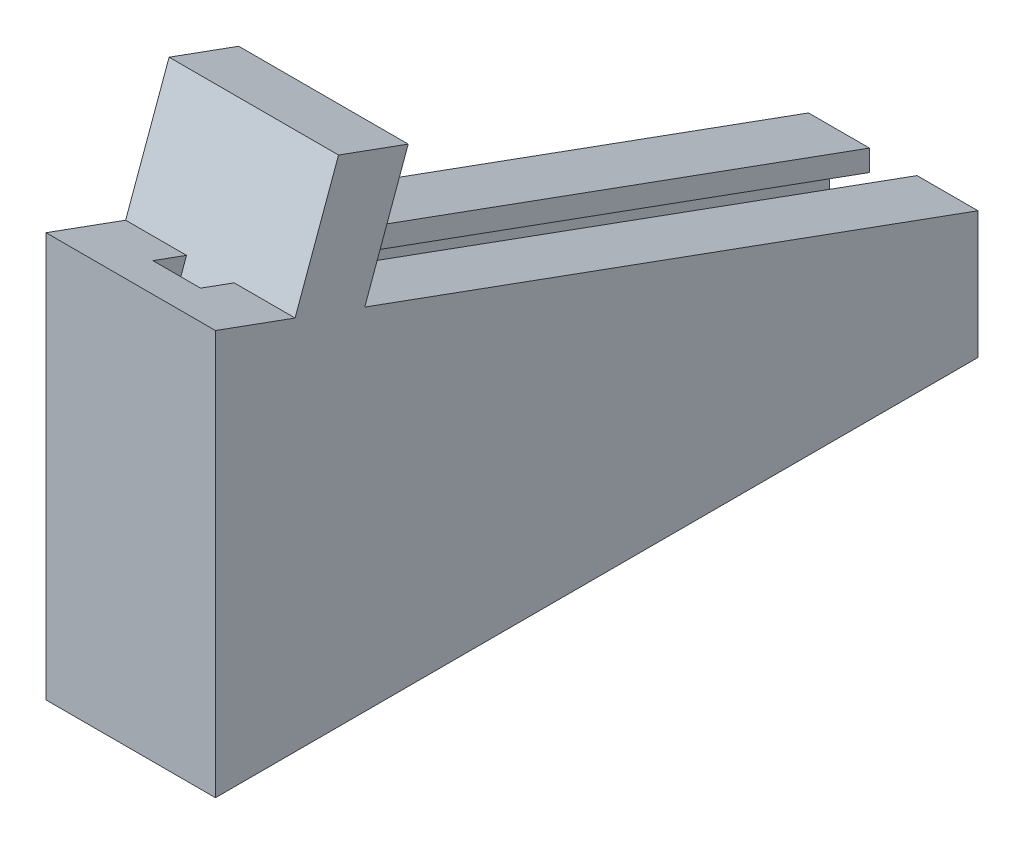
ISO-10303-21;
HEADER;
FILE_DESCRIPTION(('STEP AP214'),'2;1');
FILE_NAME('part.step','',(''),(''),'','','');
FILE_SCHEMA(('AUTOMOTIVE_DESIGN { 1 0 10303 214 1 1 1 1 }'));
ENDSEC;
DATA;
#1=APPLICATION_CONTEXT('core data for automotive mechanical design processes');
#2=APPLICATION_PROTOCOL_DEFINITION('international standard','automotive_design',2000,#1);
#3=PRODUCT_CONTEXT('',#1,'mechanical');
#4=PRODUCT('Part','Part','',(#3));
#5=PRODUCT_RELATED_PRODUCT_CATEGORY('part','',(#4));
#6=PRODUCT_DEFINITION_FORMATION('','',#4);
#7=PRODUCT_DEFINITION_CONTEXT('part definition',#1,'design');
#8=PRODUCT_DEFINITION('design','',#6,#7);
#9=PRODUCT_DEFINITION_SHAPE('','',#8);
#10=(LENGTH_UNIT() NAMED_UNIT(*) SI_UNIT(.MILLI.,.METRE.));
#11=(NAMED_UNIT(*) PLANE_ANGLE_UNIT() SI_UNIT($,.RADIAN.));
#12=(NAMED_UNIT(*) SI_UNIT($,.STERADIAN.) SOLID_ANGLE_UNIT());
#13=UNCERTAINTY_MEASURE_WITH_UNIT(LENGTH_MEASURE(1.E-05),#10,'distance_accuracy_value','');
#14=(GEOMETRIC_REPRESENTATION_CONTEXT(3) GLOBAL_UNCERTAINTY_ASSIGNED_CONTEXT((#13)) GLOBAL_UNIT_ASSIGNED_CONTEXT((#10,
#11,#12)) REPRESENTATION_CONTEXT('',''));
#15=CARTESIAN_POINT('',(0.,0.,0.));
#16=DIRECTION('',(0.,0.,1.));
#17=DIRECTION('',(1.,0.,0.));
#18=AXIS2_PLACEMENT_3D('',#15,#16,#17);
#19=CARTESIAN_POINT('',(-8.,4.71740096382082,-1.71699353392944));
#20=DIRECTION('',(0.,0.939692620785911,-0.342020143325663));
#21=DIRECTION('',(0.,0.342020143325663,0.939692620785911));
#22=AXIS2_PLACEMENT_3D('',#19,#20,#21);
#23=PLANE('',#22);
#24=DIRECTION('',(-1.,0.,0.));
#25=VECTOR('',#24,1.);
#26=CARTESIAN_POINT('',(-8.,6.75483142002953,3.88080063821321));
#27=LINE('',#26,#25);
#28=CARTESIAN_POINT('',(-5.125,6.75483142002951,3.88080063821321));
#29=VERTEX_POINT('',#28);
#30=CARTESIAN_POINT('',(-8.,6.75483142002953,3.8808006382132));
#31=VERTEX_POINT('',#30);
#32=EDGE_CURVE('E268',#29,#31,#27,.T.);
#33=ORIENTED_EDGE('',*,*,#32,.F.);
#34=DIRECTION('',(0.,0.342020143325662,0.939692620785911));
#35=VECTOR('',#34,1.);
#36=CARTESIAN_POINT('',(-5.125,-4.1473898973855,-26.072806253282));
#37=LINE('',#36,#35);
#38=CARTESIAN_POINT('',(-5.125,-3.78294593861105,-25.0715047058925));
#39=VERTEX_POINT('',#38);
#40=EDGE_CURVE('E310',#39,#29,#37,.T.);
#41=ORIENTED_EDGE('',*,*,#40,.F.);
#42=DIRECTION('',(1.,0.,0.));
#43=VECTOR('',#42,1.);
#44=CARTESIAN_POINT('',(-8.,-3.78294593861103,-25.0715047058925));
#45=LINE('',#44,#43);
#46=CARTESIAN_POINT('',(-8.,-3.78294593861103,-25.0715047058925));
#47=VERTEX_POINT('',#46);
#48=EDGE_CURVE('E370',#47,#39,#45,.T.);
#49=ORIENTED_EDGE('',*,*,#48,.F.);
#50=DIRECTION('',(0.,0.342020143325663,0.939692620785911));
#51=VECTOR('',#50,1.);
#52=CARTESIAN_POINT('',(-8.,4.71740096382082,-1.71699353392944));
#53=LINE('',#52,#51);
#54=EDGE_CURVE('E58',#47,#31,#53,.T.);
#55=ORIENTED_EDGE('',*,*,#54,.T.);
#56=EDGE_LOOP('',(#33,#41,#49,#55));
#57=FACE_BOUND('',#56,.T.);
#58=ADVANCED_FACE('F35',(#57),#23,.T.);
#59=CARTESIAN_POINT('',(0.,6.75483142002953,3.8808006382132));
#60=VERTEX_POINT('',#59);
#61=CARTESIAN_POINT('',(-2.875,6.75483142002951,3.88080063821321));
#62=VERTEX_POINT('',#61);
#63=EDGE_CURVE('E270',#60,#62,#27,.T.);
#64=ORIENTED_EDGE('',*,*,#63,.F.);
#65=DIRECTION('',(0.,0.342020143325663,0.939692620785911));
#66=VECTOR('',#65,1.);
#67=CARTESIAN_POINT('',(0.,4.71740096382082,-1.71699353392944));
#68=LINE('',#67,#66);
#69=CARTESIAN_POINT('',(0.,-3.78294593861103,-25.0715047058925));
#70=VERTEX_POINT('',#69);
#71=EDGE_CURVE('E359',#70,#60,#68,.T.);
#72=ORIENTED_EDGE('',*,*,#71,.F.);
#73=CARTESIAN_POINT('',(-2.875,-3.78294593861105,-25.0715047058925));
#74=VERTEX_POINT('',#73);
#75=EDGE_CURVE('E373',#74,#70,#45,.T.);
#76=ORIENTED_EDGE('',*,*,#75,.F.);
#77=DIRECTION('',(0.,0.342020143325662,0.939692620785911));
#78=VECTOR('',#77,1.);
#79=CARTESIAN_POINT('',(-2.875,-4.1473898973855,-26.072806253282));
#80=LINE('',#79,#78);
#81=EDGE_CURVE('E305',#74,#62,#80,.T.);
#82=ORIENTED_EDGE('',*,*,#81,.T.);
#83=EDGE_LOOP('',(#64,#72,#76,#82));
#84=FACE_BOUND('',#83,.T.);
#85=ADVANCED_FACE('F390',(#84),#23,.T.);
#86=CARTESIAN_POINT('',(-2.875,-4.1473898973855,-26.072806253282));
#87=DIRECTION('',(-1.,0.,0.));
#88=DIRECTION('',(0.,0.,1.));
#89=AXIS2_PLACEMENT_3D('',#86,#87,#88);
#90=PLANE('',#89);
#91=DIRECTION('',(0.,-0.939692620785911,0.342020143325663));
#92=VECTOR('',#91,1.);
#93=CARTESIAN_POINT('',(-2.875,6.75483142002952,3.88080063821321));
#94=LINE('',#93,#92);
#95=CARTESIAN_POINT('',(-2.875,5.87180919847001,4.20219444305649));
#96=VERTEX_POINT('',#95);
#97=EDGE_CURVE('E265',#62,#96,#94,.T.);
#98=ORIENTED_EDGE('',*,*,#97,.F.);
#99=ORIENTED_EDGE('',*,*,#81,.F.);
#100=DIRECTION('',(0.,-1.,0.));
#101=VECTOR('',#100,1.);
#102=CARTESIAN_POINT('',(-2.875,-4.1473898973855,-25.0715047058925));
#103=LINE('',#102,#101);
#104=CARTESIAN_POINT('',(-2.875,-4.78294593861105,-25.0715047058925));
#105=VERTEX_POINT('',#104);
#106=EDGE_CURVE('E326',#74,#105,#103,.T.);
#107=ORIENTED_EDGE('',*,*,#106,.T.);
#108=DIRECTION('',(0.,0.342020143325662,0.939692620785911));
#109=VECTOR('',#108,1.);
#110=CARTESIAN_POINT('',(-2.875,-5.1473898973855,-26.072806253282));
#111=LINE('',#110,#109);
#112=EDGE_CURVE('E300',#105,#96,#111,.T.);
#113=ORIENTED_EDGE('',*,*,#112,.T.);
#114=EDGE_LOOP('',(#98,#99,#107,#113));
#115=FACE_BOUND('',#114,.T.);
#116=ADVANCED_FACE('F400',(#115),#90,.T.);
#117=CARTESIAN_POINT('',(-2.875,-5.1473898973855,-26.072806253282));
#118=DIRECTION('',(0.,-0.939692620785911,0.342020143325662));
#119=DIRECTION('',(0.,-0.342020143325662,-0.939692620785911));
#120=AXIS2_PLACEMENT_3D('',#117,#118,#119);
#121=PLANE('',#120);
#122=DIRECTION('',(1.,0.,0.));
#123=VECTOR('',#122,1.);
#124=CARTESIAN_POINT('',(-2.875,5.87180919847001,4.20219444305649));
#125=LINE('',#124,#123);
#126=CARTESIAN_POINT('',(-1.,5.87180919847001,4.20219444305648));
#127=VERTEX_POINT('',#126);
#128=EDGE_CURVE('E262',#96,#127,#125,.T.);
#129=ORIENTED_EDGE('',*,*,#128,.F.);
#130=ORIENTED_EDGE('',*,*,#112,.F.);
#131=DIRECTION('',(1.,0.,0.));
#132=VECTOR('',#131,1.);
#133=CARTESIAN_POINT('',(-2.875,-4.78294593861105,-25.0715047058925));
#134=LINE('',#133,#132);
#135=CARTESIAN_POINT('',(-1.,-4.78294593861105,-25.0715047058925));
#136=VERTEX_POINT('',#135);
#137=EDGE_CURVE('E323',#105,#136,#134,.T.);
#138=ORIENTED_EDGE('',*,*,#137,.T.);
#139=DIRECTION('',(0.,0.342020143325662,0.939692620785911));
#140=VECTOR('',#139,1.);
#141=CARTESIAN_POINT('',(-1.,-5.1473898973855,-26.072806253282));
#142=LINE('',#141,#140);
#143=EDGE_CURVE('E295',#136,#127,#142,.T.);
#144=ORIENTED_EDGE('',*,*,#143,.T.);
#145=EDGE_LOOP('',(#129,#130,#138,#144));
#146=FACE_BOUND('',#145,.T.);
#147=ADVANCED_FACE('F402',(#146),#121,.T.);
#148=CARTESIAN_POINT('',(-1.,-5.1473898973855,-26.072806253282));
#149=DIRECTION('',(-1.,0.,0.));
#150=DIRECTION('',(0.,-1.,0.));
#151=AXIS2_PLACEMENT_3D('',#148,#149,#150);
#152=PLANE('',#151);
#153=DIRECTION('',(0.,-0.939692620785911,0.342020143325663));
#154=VECTOR('',#153,1.);
#155=CARTESIAN_POINT('',(-1.,5.87180919847003,4.20219444305648));
#156=LINE('',#155,#154);
#157=CARTESIAN_POINT('',(-1.,4.10576475535103,4.84498205274301));
#158=VERTEX_POINT('',#157);
#159=EDGE_CURVE('E259',#127,#158,#156,.T.);
#160=ORIENTED_EDGE('',*,*,#159,.F.);
#161=ORIENTED_EDGE('',*,*,#143,.F.);
#162=DIRECTION('',(0.,-1.,0.));
#163=VECTOR('',#162,1.);
#164=CARTESIAN_POINT('',(-1.,-5.1473898973855,-25.0715047058925));
#165=LINE('',#164,#163);
#166=CARTESIAN_POINT('',(-1.,-6.78294593861104,-25.0715047058925));
#167=VERTEX_POINT('',#166);
#168=EDGE_CURVE('E320',#136,#167,#165,.T.);
#169=ORIENTED_EDGE('',*,*,#168,.T.);
#170=DIRECTION('',(0.,0.342020143325662,0.939692620785911));
#171=VECTOR('',#170,1.);
#172=CARTESIAN_POINT('',(-1.,-7.1473898973855,-26.072806253282));
#173=LINE('',#172,#171);
#174=EDGE_CURVE('E290',#167,#158,#173,.T.);
#175=ORIENTED_EDGE('',*,*,#174,.T.);
#176=EDGE_LOOP('',(#160,#161,#169,#175));
#177=FACE_BOUND('',#176,.T.);
#178=ADVANCED_FACE('F404',(#177),#152,.T.);
#179=CARTESIAN_POINT('',(-1.,-7.1473898973855,-26.072806253282));
#180=DIRECTION('',(0.,0.939692620785911,-0.342020143325662));
#181=DIRECTION('',(0.,0.342020143325662,0.939692620785911));
#182=AXIS2_PLACEMENT_3D('',#179,#180,#181);
#183=PLANE('',#182);
#184=DIRECTION('',(-1.,0.,0.));
#185=VECTOR('',#184,1.);
#186=CARTESIAN_POINT('',(-1.,4.10576475535103,4.84498205274301));
#187=LINE('',#186,#185);
#188=CARTESIAN_POINT('',(-7.,4.10576475535102,4.844982052743));
#189=VERTEX_POINT('',#188);
#190=EDGE_CURVE('E256',#158,#189,#187,.T.);
#191=ORIENTED_EDGE('',*,*,#190,.F.);
#192=ORIENTED_EDGE('',*,*,#174,.F.);
#193=DIRECTION('',(-1.,0.,0.));
#194=VECTOR('',#193,1.);
#195=CARTESIAN_POINT('',(-1.,-6.78294593861104,-25.0715047058925));
#196=LINE('',#195,#194);
#197=CARTESIAN_POINT('',(-7.,-6.78294593861104,-25.0715047058925));
#198=VERTEX_POINT('',#197);
#199=EDGE_CURVE('E317',#167,#198,#196,.T.);
#200=ORIENTED_EDGE('',*,*,#199,.T.);
#201=DIRECTION('',(0.,0.342020143325662,0.939692620785911));
#202=VECTOR('',#201,1.);
#203=CARTESIAN_POINT('',(-7.,-7.1473898973855,-26.072806253282));
#204=LINE('',#203,#202);
#205=EDGE_CURVE('E285',#198,#189,#204,.T.);
#206=ORIENTED_EDGE('',*,*,#205,.T.);
#207=EDGE_LOOP('',(#191,#192,#200,#206));
#208=FACE_BOUND('',#207,.T.);
#209=ADVANCED_FACE('F407',(#208),#183,.T.);
#210=CARTESIAN_POINT('',(-7.,-7.1473898973855,-26.072806253282));
#211=DIRECTION('',(1.,0.,0.));
#212=DIRECTION('',(0.,0.,-1.));
#213=AXIS2_PLACEMENT_3D('',#210,#211,#212);
#214=PLANE('',#213);
#215=DIRECTION('',(0.,0.939692620785911,-0.342020143325663));
#216=VECTOR('',#215,1.);
#217=CARTESIAN_POINT('',(-7.,4.10576475535104,4.84498205274301));
#218=LINE('',#217,#216);
#219=CARTESIAN_POINT('',(-7.,5.87180919847001,4.20219444305649));
#220=VERTEX_POINT('',#219);
#221=EDGE_CURVE('E253',#189,#220,#218,.T.);
#222=ORIENTED_EDGE('',*,*,#221,.F.);
#223=ORIENTED_EDGE('',*,*,#205,.F.);
#224=DIRECTION('',(0.,1.,0.));
#225=VECTOR('',#224,1.);
#226=CARTESIAN_POINT('',(-7.,-7.1473898973855,-25.0715047058925));
#227=LINE('',#226,#225);
#228=CARTESIAN_POINT('',(-7.,-4.78294593861105,-25.0715047058925));
#229=VERTEX_POINT('',#228);
#230=EDGE_CURVE('E314',#198,#229,#227,.T.);
#231=ORIENTED_EDGE('',*,*,#230,.T.);
#232=DIRECTION('',(0.,0.342020143325662,0.939692620785911));
#233=VECTOR('',#232,1.);
#234=CARTESIAN_POINT('',(-7.,-5.1473898973855,-26.072806253282));
#235=LINE('',#234,#233);
#236=EDGE_CURVE('E280',#229,#220,#235,.T.);
#237=ORIENTED_EDGE('',*,*,#236,.T.);
#238=EDGE_LOOP('',(#222,#223,#231,#237));
#239=FACE_BOUND('',#238,.T.);
#240=ADVANCED_FACE('F410',(#239),#214,.T.);
#241=CARTESIAN_POINT('',(-7.,-5.1473898973855,-26.072806253282));
#242=DIRECTION('',(0.,-0.939692620785911,0.342020143325662));
#243=DIRECTION('',(0.,-0.342020143325662,-0.939692620785911));
#244=AXIS2_PLACEMENT_3D('',#241,#242,#243);
#245=PLANE('',#244);
#246=DIRECTION('',(1.,0.,0.));
#247=VECTOR('',#246,1.);
#248=CARTESIAN_POINT('',(-7.,5.87180919847001,4.20219444305649));
#249=LINE('',#248,#247);
#250=CARTESIAN_POINT('',(-5.125,5.87180919847001,4.20219444305648));
#251=VERTEX_POINT('',#250);
#252=EDGE_CURVE('E250',#220,#251,#249,.T.);
#253=ORIENTED_EDGE('',*,*,#252,.F.);
#254=ORIENTED_EDGE('',*,*,#236,.F.);
#255=DIRECTION('',(1.,0.,0.));
#256=VECTOR('',#255,1.);
#257=CARTESIAN_POINT('',(-7.,-4.78294593861105,-25.0715047058925));
#258=LINE('',#257,#256);
#259=CARTESIAN_POINT('',(-5.125,-4.78294593861105,-25.0715047058925));
#260=VERTEX_POINT('',#259);
#261=EDGE_CURVE('E311',#229,#260,#258,.T.);
#262=ORIENTED_EDGE('',*,*,#261,.T.);
#263=DIRECTION('',(0.,0.342020143325662,0.939692620785911));
#264=VECTOR('',#263,1.);
#265=CARTESIAN_POINT('',(-5.125,-5.1473898973855,-26.072806253282));
#266=LINE('',#265,#264);
#267=EDGE_CURVE('E275',#260,#251,#266,.T.);
#268=ORIENTED_EDGE('',*,*,#267,.T.);
#269=EDGE_LOOP('',(#253,#254,#262,#268));
#270=FACE_BOUND('',#269,.T.);
#271=ADVANCED_FACE('F413',(#270),#245,.T.);
#272=CARTESIAN_POINT('',(-5.125,-5.1473898973855,-26.072806253282));
#273=DIRECTION('',(1.,0.,0.));
#274=DIRECTION('',(0.,0.,-1.));
#275=AXIS2_PLACEMENT_3D('',#272,#273,#274);
#276=PLANE('',#275);
#277=DIRECTION('',(0.,0.939692620785911,-0.342020143325663));
#278=VECTOR('',#277,1.);
#279=CARTESIAN_POINT('',(-5.125,5.87180919847003,4.20219444305648));
#280=LINE('',#279,#278);
#281=EDGE_CURVE('E11',#251,#29,#280,.T.);
#282=ORIENTED_EDGE('',*,*,#281,.F.);
#283=ORIENTED_EDGE('',*,*,#267,.F.);
#284=DIRECTION('',(0.,1.,0.));
#285=VECTOR('',#284,1.);
#286=CARTESIAN_POINT('',(-5.125,-5.1473898973855,-25.0715047058925));
#287=LINE('',#286,#285);
#288=EDGE_CURVE('E274',#260,#39,#287,.T.);
#289=ORIENTED_EDGE('',*,*,#288,.T.);
#290=ORIENTED_EDGE('',*,*,#40,.T.);
#291=EDGE_LOOP('',(#282,#283,#289,#290));
#292=FACE_BOUND('',#291,.T.);
#293=ADVANCED_FACE('F417',(#292),#276,.T.);
#294=DIRECTION('',(1.,0.,0.));
#295=VECTOR('',#294,1.);
#296=CARTESIAN_POINT('',(-8.,7.95190192166935,7.16972481096389));
#297=LINE('',#296,#295);
#298=CARTESIAN_POINT('',(-8.,7.95190192166935,7.16972481096389));
#299=VERTEX_POINT('',#298);
#300=CARTESIAN_POINT('',(-5.125,7.95190192166932,7.1697248109639));
#301=VERTEX_POINT('',#300);
#302=EDGE_CURVE('E50',#299,#301,#297,.T.);
#303=ORIENTED_EDGE('',*,*,#302,.F.);
#304=CARTESIAN_POINT('',(-8.,9.319982494972,10.9284952941075));
#305=VERTEX_POINT('',#304);
#306=EDGE_CURVE('E349',#299,#305,#53,.T.);
#307=ORIENTED_EDGE('',*,*,#306,.T.);
#308=DIRECTION('',(1.,0.,0.));
#309=VECTOR('',#308,1.);
#310=CARTESIAN_POINT('',(-8.,9.319982494972,10.9284952941075));
#311=LINE('',#310,#309);
#312=CARTESIAN_POINT('',(0.,9.319982494972,10.9284952941075));
#313=VERTEX_POINT('',#312);
#314=EDGE_CURVE('E358',#305,#313,#311,.T.);
#315=ORIENTED_EDGE('',*,*,#314,.T.);
#316=CARTESIAN_POINT('',(0.,7.95190192166935,7.16972481096389));
#317=VERTEX_POINT('',#316);
#318=EDGE_CURVE('E313',#317,#313,#68,.T.);
#319=ORIENTED_EDGE('',*,*,#318,.F.);
#320=CARTESIAN_POINT('',(-2.875,7.95190192166932,7.1697248109639));
#321=VERTEX_POINT('',#320);
#322=EDGE_CURVE('E205',#321,#317,#297,.T.);
#323=ORIENTED_EDGE('',*,*,#322,.F.);
#324=CARTESIAN_POINT('',(-2.875,8.52977922111284,8.75742964240029));
#325=VERTEX_POINT('',#324);
#326=EDGE_CURVE('E309',#321,#325,#80,.T.);
#327=ORIENTED_EDGE('',*,*,#326,.T.);
#328=DIRECTION('',(1.,0.,0.));
#329=VECTOR('',#328,1.);
#330=CARTESIAN_POINT('',(-5.125,8.52977922111288,8.75742964240028));
#331=LINE('',#330,#329);
#332=CARTESIAN_POINT('',(-5.125,8.52977922111284,8.75742964240029));
#333=VERTEX_POINT('',#332);
#334=EDGE_CURVE('E306',#333,#325,#331,.T.);
#335=ORIENTED_EDGE('',*,*,#334,.F.);
#336=EDGE_CURVE('E346',#301,#333,#37,.T.);
#337=ORIENTED_EDGE('',*,*,#336,.F.);
#338=EDGE_LOOP('',(#303,#307,#315,#319,#323,#327,#335,#337));
#339=FACE_BOUND('',#338,.T.);
#340=ADVANCED_FACE('F37',(#339),#23,.T.);
#341=CARTESIAN_POINT('',(-8.,0.,-25.0715047058925));
#342=DIRECTION('',(0.,0.,-1.));
#343=DIRECTION('',(-1.,0.,0.));
#344=AXIS2_PLACEMENT_3D('',#341,#342,#343);
#345=PLANE('',#344);
#346=ORIENTED_EDGE('',*,*,#137,.F.);
#347=ORIENTED_EDGE('',*,*,#106,.F.);
#348=ORIENTED_EDGE('',*,*,#75,.T.);
#349=DIRECTION('',(0.,1.,0.));
#350=VECTOR('',#349,1.);
#351=CARTESIAN_POINT('',(0.,0.,-25.0715047058925));
#352=LINE('',#351,#350);
#353=CARTESIAN_POINT('',(0.,-9.78294593861103,-25.0715047058925));
#354=VERTEX_POINT('',#353);
#355=EDGE_CURVE('E367',#354,#70,#352,.T.);
#356=ORIENTED_EDGE('',*,*,#355,.F.);
#357=DIRECTION('',(1.,0.,0.));
#358=VECTOR('',#357,1.);
#359=CARTESIAN_POINT('',(-8.,-9.78294593861103,-25.0715047058925));
#360=LINE('',#359,#358);
#361=CARTESIAN_POINT('',(-8.,-9.78294593861103,-25.0715047058925));
#362=VERTEX_POINT('',#361);
#363=EDGE_CURVE('E374',#362,#354,#360,.T.);
#364=ORIENTED_EDGE('',*,*,#363,.F.);
#365=DIRECTION('',(0.,1.,0.));
#366=VECTOR('',#365,1.);
#367=CARTESIAN_POINT('',(-8.,0.,-25.0715047058925));
#368=LINE('',#367,#366);
#369=EDGE_CURVE('E355',#362,#47,#368,.T.);
#370=ORIENTED_EDGE('',*,*,#369,.T.);
#371=ORIENTED_EDGE('',*,*,#48,.T.);
#372=ORIENTED_EDGE('',*,*,#288,.F.);
#373=ORIENTED_EDGE('',*,*,#261,.F.);
#374=ORIENTED_EDGE('',*,*,#230,.F.);
#375=ORIENTED_EDGE('',*,*,#199,.F.);
#376=ORIENTED_EDGE('',*,*,#168,.F.);
#377=EDGE_LOOP('',(#346,#347,#348,#356,#364,#370,#371,#372,#373,#374,#375,#376));
#378=FACE_BOUND('',#377,.T.);
#379=ADVANCED_FACE('F396',(#378),#345,.T.);
#380=CARTESIAN_POINT('',(-8.,-9.78294593861103,0.));
#381=DIRECTION('',(0.,-1.,0.));
#382=DIRECTION('',(0.,0.,-1.));
#383=AXIS2_PLACEMENT_3D('',#380,#381,#382);
#384=PLANE('',#383);
#385=DIRECTION('',(0.,0.,-1.));
#386=VECTOR('',#385,1.);
#387=CARTESIAN_POINT('',(0.,-9.78294593861103,0.));
#388=LINE('',#387,#386);
#389=CARTESIAN_POINT('',(0.,-9.78294593861103,10.9284952941075));
#390=VERTEX_POINT('',#389);
#391=EDGE_CURVE('E364',#390,#354,#388,.T.);
#392=ORIENTED_EDGE('',*,*,#391,.F.);
#393=DIRECTION('',(1.,0.,0.));
#394=VECTOR('',#393,1.);
#395=CARTESIAN_POINT('',(-8.,-9.78294593861103,10.9284952941075));
#396=LINE('',#395,#394);
#397=CARTESIAN_POINT('',(-8.,-9.78294593861103,10.9284952941075));
#398=VERTEX_POINT('',#397);
#399=EDGE_CURVE('E376',#398,#390,#396,.T.);
#400=ORIENTED_EDGE('',*,*,#399,.F.);
#401=DIRECTION('',(0.,0.,-1.));
#402=VECTOR('',#401,1.);
#403=CARTESIAN_POINT('',(-8.,-9.78294593861103,0.));
#404=LINE('',#403,#402);
#405=EDGE_CURVE('E352',#398,#362,#404,.T.);
#406=ORIENTED_EDGE('',*,*,#405,.T.);
#407=ORIENTED_EDGE('',*,*,#363,.T.);
#408=EDGE_LOOP('',(#392,#400,#406,#407));
#409=FACE_BOUND('',#408,.T.);
#410=ADVANCED_FACE('F473',(#409),#384,.T.);
#411=CARTESIAN_POINT('',(-8.,0.,10.9284952941075));
#412=DIRECTION('',(0.,0.,1.));
#413=DIRECTION('',(0.,-1.,0.));
#414=AXIS2_PLACEMENT_3D('',#411,#412,#413);
#415=PLANE('',#414);
#416=DIRECTION('',(0.,-1.,0.));
#417=VECTOR('',#416,1.);
#418=CARTESIAN_POINT('',(0.,0.,10.9284952941075));
#419=LINE('',#418,#417);
#420=EDGE_CURVE('E361',#313,#390,#419,.T.);
#421=ORIENTED_EDGE('',*,*,#420,.F.);
#422=ORIENTED_EDGE('',*,*,#314,.F.);
#423=DIRECTION('',(0.,-1.,0.));
#424=VECTOR('',#423,1.);
#425=CARTESIAN_POINT('',(-8.,0.,10.9284952941075));
#426=LINE('',#425,#424);
#427=EDGE_CURVE('E348',#305,#398,#426,.T.);
#428=ORIENTED_EDGE('',*,*,#427,.T.);
#429=ORIENTED_EDGE('',*,*,#399,.T.);
#430=EDGE_LOOP('',(#421,#422,#428,#429));
#431=FACE_BOUND('',#430,.T.);
#432=ADVANCED_FACE('F428',(#431),#415,.T.);
#433=CARTESIAN_POINT('',(-8.,0.,0.));
#434=DIRECTION('',(1.,0.,0.));
#435=DIRECTION('',(0.,0.,-1.));
#436=AXIS2_PLACEMENT_3D('',#433,#434,#435);
#437=PLANE('',#436);
#438=ORIENTED_EDGE('',*,*,#306,.F.);
#439=DIRECTION('',(0.,0.93969262078591,-0.342020143325663));
#440=VECTOR('',#439,1.);
#441=CARTESIAN_POINT('',(-8.,5.13282405931161,8.19578524094088));
#442=LINE('',#441,#440);
#443=CARTESIAN_POINT('',(-8.,13.5900576463848,5.11760395100991));
#444=VERTEX_POINT('',#443);
#445=EDGE_CURVE('E228',#299,#444,#442,.T.);
#446=ORIENTED_EDGE('',*,*,#445,.T.);
#447=DIRECTION('',(0.,-0.342020143325663,-0.93969262078591));
#448=VECTOR('',#447,1.);
#449=CARTESIAN_POINT('',(-8.,12.392987144745,1.82867977825923));
#450=LINE('',#449,#448);
#451=CARTESIAN_POINT('',(-8.,12.392987144745,1.82867977825923));
#452=VERTEX_POINT('',#451);
#453=EDGE_CURVE('E215',#444,#452,#450,.T.);
#454=ORIENTED_EDGE('',*,*,#453,.T.);
#455=DIRECTION('',(0.,-0.93969262078591,0.342020143325663));
#456=VECTOR('',#455,1.);
#457=CARTESIAN_POINT('',(-8.,3.9357535576718,4.90686106819019));
#458=LINE('',#457,#456);
#459=EDGE_CURVE('E225',#452,#31,#458,.T.);
#460=ORIENTED_EDGE('',*,*,#459,.T.);
#461=ORIENTED_EDGE('',*,*,#54,.F.);
#462=ORIENTED_EDGE('',*,*,#369,.F.);
#463=ORIENTED_EDGE('',*,*,#405,.F.);
#464=ORIENTED_EDGE('',*,*,#427,.F.);
#465=EDGE_LOOP('',(#438,#446,#454,#460,#461,#462,#463,#464));
#466=FACE_BOUND('',#465,.T.);
#467=ADVANCED_FACE('F421',(#466),#437,.F.);
#468=CARTESIAN_POINT('',(0.,0.,0.));
#469=DIRECTION('',(1.,0.,0.));
#470=DIRECTION('',(0.,0.,-1.));
#471=AXIS2_PLACEMENT_3D('',#468,#469,#470);
#472=PLANE('',#471);
#473=ORIENTED_EDGE('',*,*,#71,.T.);
#474=DIRECTION('',(0.,-0.93969262078591,0.342020143325663));
#475=VECTOR('',#474,1.);
#476=CARTESIAN_POINT('',(0.,3.9357535576718,4.90686106819019));
#477=LINE('',#476,#475);
#478=CARTESIAN_POINT('',(0.,12.392987144745,1.82867977825923));
#479=VERTEX_POINT('',#478);
#480=EDGE_CURVE('E209',#479,#60,#477,.T.);
#481=ORIENTED_EDGE('',*,*,#480,.F.);
#482=DIRECTION('',(0.,-0.342020143325663,-0.93969262078591));
#483=VECTOR('',#482,1.);
#484=CARTESIAN_POINT('',(0.,12.392987144745,1.82867977825923));
#485=LINE('',#484,#483);
#486=CARTESIAN_POINT('',(0.,13.5900576463848,5.11760395100991));
#487=VERTEX_POINT('',#486);
#488=EDGE_CURVE('E208',#487,#479,#485,.T.);
#489=ORIENTED_EDGE('',*,*,#488,.F.);
#490=DIRECTION('',(0.,0.93969262078591,-0.342020143325663));
#491=VECTOR('',#490,1.);
#492=CARTESIAN_POINT('',(0.,5.13282405931161,8.19578524094088));
#493=LINE('',#492,#491);
#494=EDGE_CURVE('E198',#317,#487,#493,.T.);
#495=ORIENTED_EDGE('',*,*,#494,.F.);
#496=ORIENTED_EDGE('',*,*,#318,.T.);
#497=ORIENTED_EDGE('',*,*,#420,.T.);
#498=ORIENTED_EDGE('',*,*,#391,.T.);
#499=ORIENTED_EDGE('',*,*,#355,.T.);
#500=EDGE_LOOP('',(#473,#481,#489,#495,#496,#497,#498,#499));
#501=FACE_BOUND('',#500,.T.);
#502=ADVANCED_FACE('F220',(#501),#472,.T.);
#503=DIRECTION('',(0.,0.939692620785911,-0.342020143325663));
#504=VECTOR('',#503,1.);
#505=CARTESIAN_POINT('',(-2.875,7.95190192166934,7.1697248109639));
#506=LINE('',#505,#504);
#507=CARTESIAN_POINT('',(-2.875,7.06887970010983,7.49111861580717));
#508=VERTEX_POINT('',#507);
#509=EDGE_CURVE('E247',#508,#321,#506,.T.);
#510=ORIENTED_EDGE('',*,*,#509,.F.);
#511=CARTESIAN_POINT('',(-2.875,7.52977922111284,8.75742964240029));
#512=VERTEX_POINT('',#511);
#513=EDGE_CURVE('E304',#508,#512,#111,.T.);
#514=ORIENTED_EDGE('',*,*,#513,.T.);
#515=DIRECTION('',(0.,-1.,0.));
#516=VECTOR('',#515,1.);
#517=CARTESIAN_POINT('',(-2.875,8.52977922111288,8.75742964240028));
#518=LINE('',#517,#516);
#519=EDGE_CURVE('E301',#325,#512,#518,.T.);
#520=ORIENTED_EDGE('',*,*,#519,.F.);
#521=ORIENTED_EDGE('',*,*,#326,.F.);
#522=EDGE_LOOP('',(#510,#514,#520,#521));
#523=FACE_BOUND('',#522,.T.);
#524=ADVANCED_FACE('F432',(#523),#90,.T.);
#525=DIRECTION('',(-1.,0.,0.));
#526=VECTOR('',#525,1.);
#527=CARTESIAN_POINT('',(-2.875,7.06887970010983,7.49111861580717));
#528=LINE('',#527,#526);
#529=CARTESIAN_POINT('',(-1.,7.06887970010983,7.49111861580716));
#530=VERTEX_POINT('',#529);
#531=EDGE_CURVE('E244',#530,#508,#528,.T.);
#532=ORIENTED_EDGE('',*,*,#531,.F.);
#533=CARTESIAN_POINT('',(-1.,7.52977922111284,8.75742964240029));
#534=VERTEX_POINT('',#533);
#535=EDGE_CURVE('E299',#530,#534,#142,.T.);
#536=ORIENTED_EDGE('',*,*,#535,.T.);
#537=DIRECTION('',(1.,0.,0.));
#538=VECTOR('',#537,1.);
#539=CARTESIAN_POINT('',(-2.875,7.52977922111288,8.75742964240028));
#540=LINE('',#539,#538);
#541=EDGE_CURVE('E296',#512,#534,#540,.T.);
#542=ORIENTED_EDGE('',*,*,#541,.F.);
#543=ORIENTED_EDGE('',*,*,#513,.F.);
#544=EDGE_LOOP('',(#532,#536,#542,#543));
#545=FACE_BOUND('',#544,.T.);
#546=ADVANCED_FACE('F436',(#545),#121,.T.);
#547=DIRECTION('',(0.,0.939692620785911,-0.342020143325663));
#548=VECTOR('',#547,1.);
#549=CARTESIAN_POINT('',(-1.,7.06887970010985,7.49111861580716));
#550=LINE('',#549,#548);
#551=CARTESIAN_POINT('',(-1.,5.30283525699085,8.1339062254937));
#552=VERTEX_POINT('',#551);
#553=EDGE_CURVE('E241',#552,#530,#550,.T.);
#554=ORIENTED_EDGE('',*,*,#553,.F.);
#555=CARTESIAN_POINT('',(-1.,5.52977922111284,8.75742964240029));
#556=VERTEX_POINT('',#555);
#557=EDGE_CURVE('E294',#552,#556,#173,.T.);
#558=ORIENTED_EDGE('',*,*,#557,.T.);
#559=DIRECTION('',(0.,-1.,0.));
#560=VECTOR('',#559,1.);
#561=CARTESIAN_POINT('',(-1.,7.52977922111288,8.75742964240028));
#562=LINE('',#561,#560);
#563=EDGE_CURVE('E291',#534,#556,#562,.T.);
#564=ORIENTED_EDGE('',*,*,#563,.F.);
#565=ORIENTED_EDGE('',*,*,#535,.F.);
#566=EDGE_LOOP('',(#554,#558,#564,#565));
#567=FACE_BOUND('',#566,.T.);
#568=ADVANCED_FACE('F440',(#567),#152,.T.);
#569=DIRECTION('',(1.,0.,0.));
#570=VECTOR('',#569,1.);
#571=CARTESIAN_POINT('',(-1.,5.30283525699085,8.1339062254937));
#572=LINE('',#571,#570);
#573=CARTESIAN_POINT('',(-7.,5.30283525699085,8.1339062254937));
#574=VERTEX_POINT('',#573);
#575=EDGE_CURVE('E238',#574,#552,#572,.T.);
#576=ORIENTED_EDGE('',*,*,#575,.F.);
#577=CARTESIAN_POINT('',(-7.,5.52977922111284,8.75742964240029));
#578=VERTEX_POINT('',#577);
#579=EDGE_CURVE('E289',#574,#578,#204,.T.);
#580=ORIENTED_EDGE('',*,*,#579,.T.);
#581=DIRECTION('',(-1.,0.,0.));
#582=VECTOR('',#581,1.);
#583=CARTESIAN_POINT('',(-1.,5.52977922111288,8.75742964240028));
#584=LINE('',#583,#582);
#585=EDGE_CURVE('E286',#556,#578,#584,.T.);
#586=ORIENTED_EDGE('',*,*,#585,.F.);
#587=ORIENTED_EDGE('',*,*,#557,.F.);
#588=EDGE_LOOP('',(#576,#580,#586,#587));
#589=FACE_BOUND('',#588,.T.);
#590=ADVANCED_FACE('F447',(#589),#183,.T.);
#591=DIRECTION('',(0.,-0.939692620785911,0.342020143325663));
#592=VECTOR('',#591,1.);
#593=CARTESIAN_POINT('',(-7.,5.30283525699086,8.1339062254937));
#594=LINE('',#593,#592);
#595=CARTESIAN_POINT('',(-7.,7.06887970010983,7.49111861580717));
#596=VERTEX_POINT('',#595);
#597=EDGE_CURVE('E235',#596,#574,#594,.T.);
#598=ORIENTED_EDGE('',*,*,#597,.F.);
#599=CARTESIAN_POINT('',(-7.,7.52977922111284,8.75742964240029));
#600=VERTEX_POINT('',#599);
#601=EDGE_CURVE('E284',#596,#600,#235,.T.);
#602=ORIENTED_EDGE('',*,*,#601,.T.);
#603=DIRECTION('',(0.,1.,0.));
#604=VECTOR('',#603,1.);
#605=CARTESIAN_POINT('',(-7.,5.52977922111288,8.75742964240028));
#606=LINE('',#605,#604);
#607=EDGE_CURVE('E281',#578,#600,#606,.T.);
#608=ORIENTED_EDGE('',*,*,#607,.F.);
#609=ORIENTED_EDGE('',*,*,#579,.F.);
#610=EDGE_LOOP('',(#598,#602,#608,#609));
#611=FACE_BOUND('',#610,.T.);
#612=ADVANCED_FACE('F450',(#611),#214,.T.);
#613=DIRECTION('',(-1.,0.,0.));
#614=VECTOR('',#613,1.);
#615=CARTESIAN_POINT('',(-7.,7.06887970010983,7.49111861580717));
#616=LINE('',#615,#614);
#617=CARTESIAN_POINT('',(-5.125,7.06887970010983,7.49111861580716));
#618=VERTEX_POINT('',#617);
#619=EDGE_CURVE('E231',#618,#596,#616,.T.);
#620=ORIENTED_EDGE('',*,*,#619,.F.);
#621=CARTESIAN_POINT('',(-5.125,7.52977922111284,8.75742964240029));
#622=VERTEX_POINT('',#621);
#623=EDGE_CURVE('E279',#618,#622,#266,.T.);
#624=ORIENTED_EDGE('',*,*,#623,.T.);
#625=DIRECTION('',(1.,0.,0.));
#626=VECTOR('',#625,1.);
#627=CARTESIAN_POINT('',(-7.,7.52977922111288,8.75742964240028));
#628=LINE('',#627,#626);
#629=EDGE_CURVE('E276',#600,#622,#628,.T.);
#630=ORIENTED_EDGE('',*,*,#629,.F.);
#631=ORIENTED_EDGE('',*,*,#601,.F.);
#632=EDGE_LOOP('',(#620,#624,#630,#631));
#633=FACE_BOUND('',#632,.T.);
#634=ADVANCED_FACE('F454',(#633),#245,.T.);
#635=DIRECTION('',(0.,-0.939692620785911,0.342020143325663));
#636=VECTOR('',#635,1.);
#637=CARTESIAN_POINT('',(-5.125,7.06887970010985,7.49111861580716));
#638=LINE('',#637,#636);
#639=EDGE_CURVE('E43',#301,#618,#638,.T.);
#640=ORIENTED_EDGE('',*,*,#639,.F.);
#641=ORIENTED_EDGE('',*,*,#336,.T.);
#642=DIRECTION('',(0.,1.,0.));
#643=VECTOR('',#642,1.);
#644=CARTESIAN_POINT('',(-5.125,7.52977922111288,8.75742964240028));
#645=LINE('',#644,#643);
#646=EDGE_CURVE('E271',#622,#333,#645,.T.);
#647=ORIENTED_EDGE('',*,*,#646,.F.);
#648=ORIENTED_EDGE('',*,*,#623,.F.);
#649=EDGE_LOOP('',(#640,#641,#647,#648));
#650=FACE_BOUND('',#649,.T.);
#651=ADVANCED_FACE('F382',(#650),#276,.T.);
#652=CARTESIAN_POINT('',(0.,12.3127251597239,8.75742964240028));
#653=DIRECTION('',(0.,0.,-1.));
#654=DIRECTION('',(-1.,0.,0.));
#655=AXIS2_PLACEMENT_3D('',#652,#653,#654);
#656=PLANE('',#655);
#657=ORIENTED_EDGE('',*,*,#334,.T.);
#658=ORIENTED_EDGE('',*,*,#519,.T.);
#659=ORIENTED_EDGE('',*,*,#541,.T.);
#660=ORIENTED_EDGE('',*,*,#563,.T.);
#661=ORIENTED_EDGE('',*,*,#585,.T.);
#662=ORIENTED_EDGE('',*,*,#607,.T.);
#663=ORIENTED_EDGE('',*,*,#629,.T.);
#664=ORIENTED_EDGE('',*,*,#646,.T.);
#665=EDGE_LOOP('',(#657,#658,#659,#660,#661,#662,#663,#664));
#666=FACE_BOUND('',#665,.T.);
#667=ADVANCED_FACE('F444',(#666),#656,.T.);
#668=CARTESIAN_POINT('',(0.,3.9357535576718,4.90686106819019));
#669=DIRECTION('',(0.,-0.342020143325663,-0.93969262078591));
#670=DIRECTION('',(0.,0.939692620785911,-0.342020143325663));
#671=AXIS2_PLACEMENT_3D('',#668,#669,#670);
#672=PLANE('',#671);
#673=ORIENTED_EDGE('',*,*,#480,.T.);
#674=ORIENTED_EDGE('',*,*,#63,.T.);
#675=ORIENTED_EDGE('',*,*,#97,.T.);
#676=ORIENTED_EDGE('',*,*,#128,.T.);
#677=ORIENTED_EDGE('',*,*,#159,.T.);
#678=ORIENTED_EDGE('',*,*,#190,.T.);
#679=ORIENTED_EDGE('',*,*,#221,.T.);
#680=ORIENTED_EDGE('',*,*,#252,.T.);
#681=ORIENTED_EDGE('',*,*,#281,.T.);
#682=ORIENTED_EDGE('',*,*,#32,.T.);
#683=ORIENTED_EDGE('',*,*,#459,.F.);
#684=DIRECTION('',(-1.,0.,0.));
#685=VECTOR('',#684,1.);
#686=CARTESIAN_POINT('',(0.,12.392987144745,1.82867977825923));
#687=LINE('',#686,#685);
#688=EDGE_CURVE('E216',#479,#452,#687,.T.);
#689=ORIENTED_EDGE('',*,*,#688,.F.);
#690=EDGE_LOOP('',(#673,#674,#675,#676,#677,#678,#679,#680,#681,#682,#683,#689));
#691=FACE_BOUND('',#690,.T.);
#692=ADVANCED_FACE('F387',(#691),#672,.T.);
#693=CARTESIAN_POINT('',(0.,12.392987144745,1.82867977825923));
#694=DIRECTION('',(0.,0.939692620785911,-0.342020143325663));
#695=DIRECTION('',(0.,0.342020143325663,0.939692620785911));
#696=AXIS2_PLACEMENT_3D('',#693,#694,#695);
#697=PLANE('',#696);
#698=ORIENTED_EDGE('',*,*,#453,.F.);
#699=DIRECTION('',(-1.,0.,0.));
#700=VECTOR('',#699,1.);
#701=CARTESIAN_POINT('',(0.,13.5900576463848,5.11760395100991));
#702=LINE('',#701,#700);
#703=EDGE_CURVE('E202',#487,#444,#702,.T.);
#704=ORIENTED_EDGE('',*,*,#703,.F.);
#705=ORIENTED_EDGE('',*,*,#488,.T.);
#706=ORIENTED_EDGE('',*,*,#688,.T.);
#707=EDGE_LOOP('',(#698,#704,#705,#706));
#708=FACE_BOUND('',#707,.T.);
#709=ADVANCED_FACE('F213',(#708),#697,.T.);
#710=CARTESIAN_POINT('',(0.,5.13282405931161,8.19578524094088));
#711=DIRECTION('',(0.,0.342020143325663,0.93969262078591));
#712=DIRECTION('',(0.,-0.939692620785911,0.342020143325663));
#713=AXIS2_PLACEMENT_3D('',#710,#711,#712);
#714=PLANE('',#713);
#715=ORIENTED_EDGE('',*,*,#445,.F.);
#716=ORIENTED_EDGE('',*,*,#302,.T.);
#717=ORIENTED_EDGE('',*,*,#639,.T.);
#718=ORIENTED_EDGE('',*,*,#619,.T.);
#719=ORIENTED_EDGE('',*,*,#597,.T.);
#720=ORIENTED_EDGE('',*,*,#575,.T.);
#721=ORIENTED_EDGE('',*,*,#553,.T.);
#722=ORIENTED_EDGE('',*,*,#531,.T.);
#723=ORIENTED_EDGE('',*,*,#509,.T.);
#724=ORIENTED_EDGE('',*,*,#322,.T.);
#725=ORIENTED_EDGE('',*,*,#494,.T.);
#726=ORIENTED_EDGE('',*,*,#703,.T.);
#727=EDGE_LOOP('',(#715,#716,#717,#718,#719,#720,#721,#722,#723,#724,#725,#726));
#728=FACE_BOUND('',#727,.T.);
#729=ADVANCED_FACE('F201',(#728),#714,.T.);
#730=CLOSED_SHELL('',(#58,#85,#116,#147,#178,#209,#240,#271,#293,#340,#379,#410,#432,#467,#502,
#524,#546,#568,#590,#612,#634,#651,#667,#692,#709,#729));
#731=MANIFOLD_SOLID_BREP('B2',#730);
#732=ADVANCED_BREP_SHAPE_REPRESENTATION('',(#18,#731),#14);
#733=SHAPE_DEFINITION_REPRESENTATION(#9,#732);
ENDSEC;
END-ISO-10303-21;
